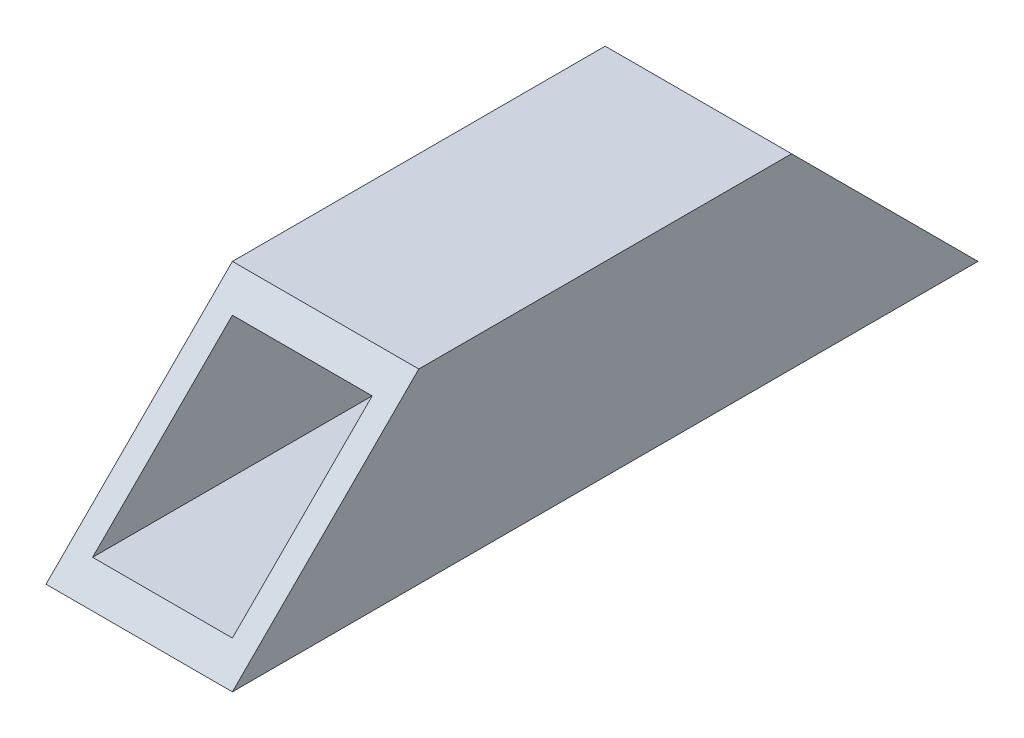
ISO-10303-21;
HEADER;
FILE_DESCRIPTION(('STEP AP214'),'2;1');
FILE_NAME('part.step','',(''),(''),'','','');
FILE_SCHEMA(('AUTOMOTIVE_DESIGN { 1 0 10303 214 1 1 1 1 }'));
ENDSEC;
DATA;
#1=APPLICATION_CONTEXT('core data for automotive mechanical design processes');
#2=APPLICATION_PROTOCOL_DEFINITION('international standard','automotive_design',2000,#1);
#3=PRODUCT_CONTEXT('',#1,'mechanical');
#4=PRODUCT('Part','Part','',(#3));
#5=PRODUCT_RELATED_PRODUCT_CATEGORY('part','',(#4));
#6=PRODUCT_DEFINITION_FORMATION('','',#4);
#7=PRODUCT_DEFINITION_CONTEXT('part definition',#1,'design');
#8=PRODUCT_DEFINITION('design','',#6,#7);
#9=PRODUCT_DEFINITION_SHAPE('','',#8);
#10=(LENGTH_UNIT() NAMED_UNIT(*) SI_UNIT(.MILLI.,.METRE.));
#11=(NAMED_UNIT(*) PLANE_ANGLE_UNIT() SI_UNIT($,.RADIAN.));
#12=(NAMED_UNIT(*) SI_UNIT($,.STERADIAN.) SOLID_ANGLE_UNIT());
#13=UNCERTAINTY_MEASURE_WITH_UNIT(LENGTH_MEASURE(1.E-05),#10,'distance_accuracy_value','');
#14=(GEOMETRIC_REPRESENTATION_CONTEXT(3) GLOBAL_UNCERTAINTY_ASSIGNED_CONTEXT((#13)) GLOBAL_UNIT_ASSIGNED_CONTEXT((#10,
#11,#12)) REPRESENTATION_CONTEXT('',''));
#15=CARTESIAN_POINT('',(0.,0.,0.));
#16=DIRECTION('',(0.,0.,1.));
#17=DIRECTION('',(1.,0.,0.));
#18=AXIS2_PLACEMENT_3D('',#15,#16,#17);
#19=CARTESIAN_POINT('',(12.7,-12.7,101.6));
#20=DIRECTION('',(-1.,0.,0.));
#21=DIRECTION('',(0.,-1.,0.));
#22=AXIS2_PLACEMENT_3D('',#19,#20,#21);
#23=PLANE('',#22);
#24=DIRECTION('',(0.,0.707106781186544,0.707106781186552));
#25=VECTOR('',#24,1.);
#26=CARTESIAN_POINT('',(12.7,-6.35000000000007,6.35));
#27=LINE('',#26,#25);
#28=CARTESIAN_POINT('',(12.7,-12.7,0.));
#29=VERTEX_POINT('',#28);
#30=CARTESIAN_POINT('',(12.7,12.7,25.4000000000003));
#31=VERTEX_POINT('',#30);
#32=EDGE_CURVE('E98',#29,#31,#27,.T.);
#33=ORIENTED_EDGE('',*,*,#32,.T.);
#34=DIRECTION('',(0.,0.,-1.));
#35=VECTOR('',#34,1.);
#36=CARTESIAN_POINT('',(12.7,12.7,101.6));
#37=LINE('',#36,#35);
#38=CARTESIAN_POINT('',(12.7,12.7,76.2000000000003));
#39=VERTEX_POINT('',#38);
#40=EDGE_CURVE('E111',#39,#31,#37,.T.);
#41=ORIENTED_EDGE('',*,*,#40,.F.);
#42=DIRECTION('',(0.,0.707106781186552,-0.707106781186544));
#43=VECTOR('',#42,1.);
#44=CARTESIAN_POINT('',(12.7,44.4500000000001,44.4500000000006));
#45=LINE('',#44,#43);
#46=CARTESIAN_POINT('',(12.7,-12.7,101.6));
#47=VERTEX_POINT('',#46);
#48=EDGE_CURVE('E150',#47,#39,#45,.T.);
#49=ORIENTED_EDGE('',*,*,#48,.F.);
#50=DIRECTION('',(0.,0.,-1.));
#51=VECTOR('',#50,1.);
#52=CARTESIAN_POINT('',(12.7,-12.7,101.6));
#53=LINE('',#52,#51);
#54=EDGE_CURVE('E113',#47,#29,#53,.T.);
#55=ORIENTED_EDGE('',*,*,#54,.T.);
#56=EDGE_LOOP('',(#33,#41,#49,#55));
#57=FACE_BOUND('',#56,.T.);
#58=ADVANCED_FACE('F33',(#57),#23,.F.);
#59=CARTESIAN_POINT('',(-12.7,12.7,101.6));
#60=DIRECTION('',(0.,-1.,0.));
#61=DIRECTION('',(0.,0.,-1.));
#62=AXIS2_PLACEMENT_3D('',#59,#60,#61);
#63=PLANE('',#62);
#64=DIRECTION('',(1.,0.,0.));
#65=VECTOR('',#64,1.);
#66=CARTESIAN_POINT('',(-48.6210244842768,12.7,25.4000000000003));
#67=LINE('',#66,#65);
#68=CARTESIAN_POINT('',(-12.7,12.7,25.4000000000003));
#69=VERTEX_POINT('',#68);
#70=EDGE_CURVE('E95',#69,#31,#67,.T.);
#71=ORIENTED_EDGE('',*,*,#70,.F.);
#72=DIRECTION('',(0.,0.,-1.));
#73=VECTOR('',#72,1.);
#74=CARTESIAN_POINT('',(-12.7,12.7,101.6));
#75=LINE('',#74,#73);
#76=CARTESIAN_POINT('',(-12.7,12.7,76.2000000000003));
#77=VERTEX_POINT('',#76);
#78=EDGE_CURVE('E118',#77,#69,#75,.T.);
#79=ORIENTED_EDGE('',*,*,#78,.F.);
#80=DIRECTION('',(1.,0.,0.));
#81=VECTOR('',#80,1.);
#82=CARTESIAN_POINT('',(-48.6210244842768,12.7,76.2000000000003));
#83=LINE('',#82,#81);
#84=EDGE_CURVE('E117',#77,#39,#83,.T.);
#85=ORIENTED_EDGE('',*,*,#84,.T.);
#86=ORIENTED_EDGE('',*,*,#40,.T.);
#87=EDGE_LOOP('',(#71,#79,#85,#86));
#88=FACE_BOUND('',#87,.T.);
#89=ADVANCED_FACE('F116',(#88),#63,.F.);
#90=CARTESIAN_POINT('',(-12.7,-12.7,101.6));
#91=DIRECTION('',(1.,0.,0.));
#92=DIRECTION('',(0.,1.,0.));
#93=AXIS2_PLACEMENT_3D('',#90,#91,#92);
#94=PLANE('',#93);
#95=DIRECTION('',(0.,-0.707106781186544,-0.707106781186551));
#96=VECTOR('',#95,1.);
#97=CARTESIAN_POINT('',(-12.7,-6.35000000000007,6.35));
#98=LINE('',#97,#96);
#99=CARTESIAN_POINT('',(-12.7,-12.7,0.));
#100=VERTEX_POINT('',#99);
#101=EDGE_CURVE('E101',#69,#100,#98,.T.);
#102=ORIENTED_EDGE('',*,*,#101,.T.);
#103=DIRECTION('',(0.,0.,-1.));
#104=VECTOR('',#103,1.);
#105=CARTESIAN_POINT('',(-12.7,-12.7,101.6));
#106=LINE('',#105,#104);
#107=CARTESIAN_POINT('',(-12.7,-12.7,101.6));
#108=VERTEX_POINT('',#107);
#109=EDGE_CURVE('E120',#108,#100,#106,.T.);
#110=ORIENTED_EDGE('',*,*,#109,.F.);
#111=DIRECTION('',(0.,-0.707106781186551,0.707106781186544));
#112=VECTOR('',#111,1.);
#113=CARTESIAN_POINT('',(-12.7,44.4500000000001,44.4500000000006));
#114=LINE('',#113,#112);
#115=EDGE_CURVE('E147',#77,#108,#114,.T.);
#116=ORIENTED_EDGE('',*,*,#115,.F.);
#117=ORIENTED_EDGE('',*,*,#78,.T.);
#118=EDGE_LOOP('',(#102,#110,#116,#117));
#119=FACE_BOUND('',#118,.T.);
#120=ADVANCED_FACE('F161',(#119),#94,.F.);
#121=CARTESIAN_POINT('',(9.525,-9.52499999999999,101.6));
#122=DIRECTION('',(-1.,0.,0.));
#123=DIRECTION('',(0.,0.,1.));
#124=AXIS2_PLACEMENT_3D('',#121,#122,#123);
#125=PLANE('',#124);
#126=DIRECTION('',(0.,0.,-1.));
#127=VECTOR('',#126,1.);
#128=CARTESIAN_POINT('',(9.525,9.52500000000001,101.6));
#129=LINE('',#128,#127);
#130=CARTESIAN_POINT('',(9.52499999999999,9.52500000000001,79.3750000000003));
#131=VERTEX_POINT('',#130);
#132=CARTESIAN_POINT('',(9.52499999999999,9.52500000000001,22.2250000000002));
#133=VERTEX_POINT('',#132);
#134=EDGE_CURVE('E129',#131,#133,#129,.T.);
#135=ORIENTED_EDGE('',*,*,#134,.T.);
#136=DIRECTION('',(0.,-0.707106781186544,-0.707106781186551));
#137=VECTOR('',#136,1.);
#138=CARTESIAN_POINT('',(9.525,39.6875,52.3875000000006));
#139=LINE('',#138,#137);
#140=CARTESIAN_POINT('',(9.52499999999999,-9.52499999999999,3.17500000000002));
#141=VERTEX_POINT('',#140);
#142=EDGE_CURVE('E152',#133,#141,#139,.T.);
#143=ORIENTED_EDGE('',*,*,#142,.T.);
#144=DIRECTION('',(0.,0.,-1.));
#145=VECTOR('',#144,1.);
#146=CARTESIAN_POINT('',(9.525,-9.52499999999999,101.6));
#147=LINE('',#146,#145);
#148=CARTESIAN_POINT('',(9.525,-9.52499999999999,98.425));
#149=VERTEX_POINT('',#148);
#150=EDGE_CURVE('E139',#149,#141,#147,.T.);
#151=ORIENTED_EDGE('',*,*,#150,.F.);
#152=DIRECTION('',(0.,-0.707106781186551,0.707106781186544));
#153=VECTOR('',#152,1.);
#154=CARTESIAN_POINT('',(9.525,-11.1125,100.0125));
#155=LINE('',#154,#153);
#156=EDGE_CURVE('E54',#131,#149,#155,.T.);
#157=ORIENTED_EDGE('',*,*,#156,.F.);
#158=EDGE_LOOP('',(#135,#143,#151,#157));
#159=FACE_BOUND('',#158,.T.);
#160=ADVANCED_FACE('F186',(#159),#125,.T.);
#161=CARTESIAN_POINT('',(-9.52500000000001,9.52500000000001,101.6));
#162=DIRECTION('',(0.,-1.,0.));
#163=DIRECTION('',(0.,0.,-1.));
#164=AXIS2_PLACEMENT_3D('',#161,#162,#163);
#165=PLANE('',#164);
#166=DIRECTION('',(0.,0.,-1.));
#167=VECTOR('',#166,1.);
#168=CARTESIAN_POINT('',(-9.52500000000001,9.52500000000001,101.6));
#169=LINE('',#168,#167);
#170=CARTESIAN_POINT('',(-9.52500000000001,9.52500000000001,79.3750000000002));
#171=VERTEX_POINT('',#170);
#172=CARTESIAN_POINT('',(-9.52500000000001,9.52500000000001,22.2250000000002));
#173=VERTEX_POINT('',#172);
#174=EDGE_CURVE('E133',#171,#173,#169,.T.);
#175=ORIENTED_EDGE('',*,*,#174,.T.);
#176=DIRECTION('',(1.,0.,0.));
#177=VECTOR('',#176,1.);
#178=CARTESIAN_POINT('',(-9.52500000000001,9.52500000000001,22.2250000000002));
#179=LINE('',#178,#177);
#180=EDGE_CURVE('E155',#173,#133,#179,.T.);
#181=ORIENTED_EDGE('',*,*,#180,.T.);
#182=ORIENTED_EDGE('',*,*,#134,.F.);
#183=DIRECTION('',(1.,0.,0.));
#184=VECTOR('',#183,1.);
#185=CARTESIAN_POINT('',(-9.525,9.52500000000001,79.3750000000003));
#186=LINE('',#185,#184);
#187=EDGE_CURVE('E143',#171,#131,#186,.T.);
#188=ORIENTED_EDGE('',*,*,#187,.F.);
#189=EDGE_LOOP('',(#175,#181,#182,#188));
#190=FACE_BOUND('',#189,.T.);
#191=ADVANCED_FACE('F191',(#190),#165,.T.);
#192=CARTESIAN_POINT('',(-9.52500000000001,-9.52499999999999,101.6));
#193=DIRECTION('',(1.,0.,0.));
#194=DIRECTION('',(0.,0.,-1.));
#195=AXIS2_PLACEMENT_3D('',#192,#193,#194);
#196=PLANE('',#195);
#197=DIRECTION('',(0.,0.,-1.));
#198=VECTOR('',#197,1.);
#199=CARTESIAN_POINT('',(-9.52500000000001,-9.52499999999999,101.6));
#200=LINE('',#199,#198);
#201=CARTESIAN_POINT('',(-9.52500000000001,-9.52499999999999,98.425));
#202=VERTEX_POINT('',#201);
#203=CARTESIAN_POINT('',(-9.52500000000001,-9.52499999999999,3.17500000000003));
#204=VERTEX_POINT('',#203);
#205=EDGE_CURVE('E136',#202,#204,#200,.T.);
#206=ORIENTED_EDGE('',*,*,#205,.T.);
#207=DIRECTION('',(0.,0.707106781186544,0.707106781186551));
#208=VECTOR('',#207,1.);
#209=CARTESIAN_POINT('',(-9.52500000000001,39.6875,52.3875000000006));
#210=LINE('',#209,#208);
#211=EDGE_CURVE('E47',#204,#173,#210,.T.);
#212=ORIENTED_EDGE('',*,*,#211,.T.);
#213=ORIENTED_EDGE('',*,*,#174,.F.);
#214=DIRECTION('',(0.,0.707106781186551,-0.707106781186544));
#215=VECTOR('',#214,1.);
#216=CARTESIAN_POINT('',(-9.52500000000001,-11.1125,100.0125));
#217=LINE('',#216,#215);
#218=EDGE_CURVE('E145',#202,#171,#217,.T.);
#219=ORIENTED_EDGE('',*,*,#218,.F.);
#220=EDGE_LOOP('',(#206,#212,#213,#219));
#221=FACE_BOUND('',#220,.T.);
#222=ADVANCED_FACE('F195',(#221),#196,.T.);
#223=CARTESIAN_POINT('',(-9.52500000000001,-9.52499999999999,101.6));
#224=DIRECTION('',(0.,1.,0.));
#225=DIRECTION('',(0.,0.,1.));
#226=AXIS2_PLACEMENT_3D('',#223,#224,#225);
#227=PLANE('',#226);
#228=ORIENTED_EDGE('',*,*,#150,.T.);
#229=DIRECTION('',(-1.,0.,0.));
#230=VECTOR('',#229,1.);
#231=CARTESIAN_POINT('',(-9.52500000000001,-9.52499999999999,3.17500000000003));
#232=LINE('',#231,#230);
#233=EDGE_CURVE('E11',#141,#204,#232,.T.);
#234=ORIENTED_EDGE('',*,*,#233,.T.);
#235=ORIENTED_EDGE('',*,*,#205,.F.);
#236=DIRECTION('',(-1.,0.,0.));
#237=VECTOR('',#236,1.);
#238=CARTESIAN_POINT('',(-9.52500000000001,-9.52499999999999,98.425));
#239=LINE('',#238,#237);
#240=EDGE_CURVE('E40',#149,#202,#239,.T.);
#241=ORIENTED_EDGE('',*,*,#240,.F.);
#242=EDGE_LOOP('',(#228,#234,#235,#241));
#243=FACE_BOUND('',#242,.T.);
#244=ADVANCED_FACE('F176',(#243),#227,.T.);
#245=CARTESIAN_POINT('',(-12.7,-12.7,101.6));
#246=DIRECTION('',(0.,1.,0.));
#247=DIRECTION('',(0.,0.,1.));
#248=AXIS2_PLACEMENT_3D('',#245,#246,#247);
#249=PLANE('',#248);
#250=DIRECTION('',(1.,0.,0.));
#251=VECTOR('',#250,1.);
#252=CARTESIAN_POINT('',(-12.7,-12.7,0.));
#253=LINE('',#252,#251);
#254=EDGE_CURVE('E127',#100,#29,#253,.T.);
#255=ORIENTED_EDGE('',*,*,#254,.T.);
#256=ORIENTED_EDGE('',*,*,#54,.F.);
#257=DIRECTION('',(1.,0.,0.));
#258=VECTOR('',#257,1.);
#259=CARTESIAN_POINT('',(-12.7,-12.7,101.6));
#260=LINE('',#259,#258);
#261=EDGE_CURVE('E126',#108,#47,#260,.T.);
#262=ORIENTED_EDGE('',*,*,#261,.F.);
#263=ORIENTED_EDGE('',*,*,#109,.T.);
#264=EDGE_LOOP('',(#255,#256,#262,#263));
#265=FACE_BOUND('',#264,.T.);
#266=ADVANCED_FACE('F165',(#265),#249,.F.);
#267=CARTESIAN_POINT('',(-48.6210244842768,44.4500000000001,44.4500000000006));
#268=DIRECTION('',(0.,-0.707106781186544,-0.707106781186551));
#269=DIRECTION('',(0.,0.707106781186551,-0.707106781186544));
#270=AXIS2_PLACEMENT_3D('',#267,#268,#269);
#271=PLANE('',#270);
#272=ORIENTED_EDGE('',*,*,#156,.T.);
#273=ORIENTED_EDGE('',*,*,#240,.T.);
#274=ORIENTED_EDGE('',*,*,#218,.T.);
#275=ORIENTED_EDGE('',*,*,#187,.T.);
#276=EDGE_LOOP('',(#272,#273,#274,#275));
#277=FACE_BOUND('',#276,.T.);
#278=ORIENTED_EDGE('',*,*,#115,.T.);
#279=ORIENTED_EDGE('',*,*,#261,.T.);
#280=ORIENTED_EDGE('',*,*,#48,.T.);
#281=ORIENTED_EDGE('',*,*,#84,.F.);
#282=EDGE_LOOP('',(#278,#279,#280,#281));
#283=FACE_BOUND('',#282,.T.);
#284=ADVANCED_FACE('F167',(#277,#283),#271,.F.);
#285=CARTESIAN_POINT('',(-48.6210244842768,-6.35000000000007,6.35));
#286=DIRECTION('',(0.,0.707106781186551,-0.707106781186544));
#287=DIRECTION('',(0.,0.707106781186544,0.707106781186551));
#288=AXIS2_PLACEMENT_3D('',#285,#286,#287);
#289=PLANE('',#288);
#290=ORIENTED_EDGE('',*,*,#180,.F.);
#291=ORIENTED_EDGE('',*,*,#211,.F.);
#292=ORIENTED_EDGE('',*,*,#233,.F.);
#293=ORIENTED_EDGE('',*,*,#142,.F.);
#294=EDGE_LOOP('',(#290,#291,#292,#293));
#295=FACE_BOUND('',#294,.T.);
#296=ORIENTED_EDGE('',*,*,#70,.T.);
#297=ORIENTED_EDGE('',*,*,#32,.F.);
#298=ORIENTED_EDGE('',*,*,#254,.F.);
#299=ORIENTED_EDGE('',*,*,#101,.F.);
#300=EDGE_LOOP('',(#296,#297,#298,#299));
#301=FACE_BOUND('',#300,.T.);
#302=ADVANCED_FACE('F97',(#295,#301),#289,.T.);
#303=CLOSED_SHELL('',(#58,#89,#120,#160,#191,#222,#244,#266,#284,#302));
#304=MANIFOLD_SOLID_BREP('B2',#303);
#305=ADVANCED_BREP_SHAPE_REPRESENTATION('',(#18,#304),#14);
#306=SHAPE_DEFINITION_REPRESENTATION(#9,#305);
ENDSEC;
END-ISO-10303-21;
